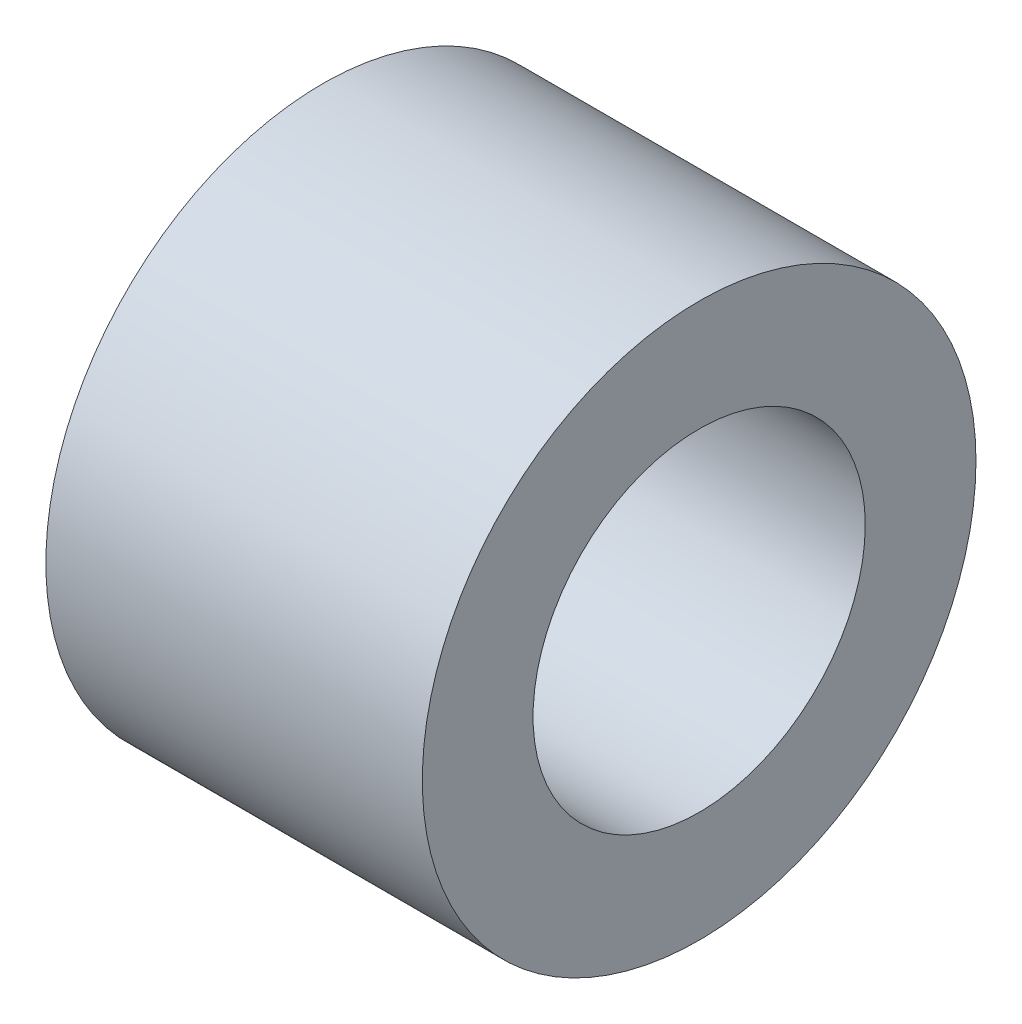
ISO-10303-21;
HEADER;
FILE_DESCRIPTION(('STEP AP214'),'2;1');
FILE_NAME('part.step','',(''),(''),'','','');
FILE_SCHEMA(('AUTOMOTIVE_DESIGN { 1 0 10303 214 1 1 1 1 }'));
ENDSEC;
DATA;
#1=APPLICATION_CONTEXT('core data for automotive mechanical design processes');
#2=APPLICATION_PROTOCOL_DEFINITION('international standard','automotive_design',2000,#1);
#3=PRODUCT_CONTEXT('',#1,'mechanical');
#4=PRODUCT('Part','Part','',(#3));
#5=PRODUCT_RELATED_PRODUCT_CATEGORY('part','',(#4));
#6=PRODUCT_DEFINITION_FORMATION('','',#4);
#7=PRODUCT_DEFINITION_CONTEXT('part definition',#1,'design');
#8=PRODUCT_DEFINITION('design','',#6,#7);
#9=PRODUCT_DEFINITION_SHAPE('','',#8);
#10=(LENGTH_UNIT() NAMED_UNIT(*) SI_UNIT(.MILLI.,.METRE.));
#11=(NAMED_UNIT(*) PLANE_ANGLE_UNIT() SI_UNIT($,.RADIAN.));
#12=(NAMED_UNIT(*) SI_UNIT($,.STERADIAN.) SOLID_ANGLE_UNIT());
#13=UNCERTAINTY_MEASURE_WITH_UNIT(LENGTH_MEASURE(1.E-05),#10,'distance_accuracy_value','');
#14=(GEOMETRIC_REPRESENTATION_CONTEXT(3) GLOBAL_UNCERTAINTY_ASSIGNED_CONTEXT((#13)) GLOBAL_UNIT_ASSIGNED_CONTEXT((#10,
#11,#12)) REPRESENTATION_CONTEXT('',''));
#15=CARTESIAN_POINT('',(0.,0.,0.));
#16=DIRECTION('',(0.,0.,1.));
#17=DIRECTION('',(1.,0.,0.));
#18=AXIS2_PLACEMENT_3D('',#15,#16,#17);
#19=CARTESIAN_POINT('',(3.4,0.,0.));
#20=DIRECTION('',(1.,0.,0.));
#21=DIRECTION('',(0.,0.,-1.));
#22=AXIS2_PLACEMENT_3D('',#19,#20,#21);
#23=PLANE('',#22);
#24=CARTESIAN_POINT('',(3.4,0.,0.));
#25=DIRECTION('',(1.,0.,0.));
#26=DIRECTION('',(0.,0.,-1.));
#27=AXIS2_PLACEMENT_3D('',#24,#25,#26);
#28=CIRCLE('',#27,2.5);
#29=CARTESIAN_POINT('',(3.4,0.,-2.5));
#30=VERTEX_POINT('',#29);
#31=EDGE_CURVE('E10',#30,#30,#28,.T.);
#32=ORIENTED_EDGE('',*,*,#31,.T.);
#33=EDGE_LOOP('',(#32));
#34=FACE_BOUND('',#33,.T.);
#35=CARTESIAN_POINT('',(3.4,0.,0.));
#36=DIRECTION('',(1.,0.,0.));
#37=DIRECTION('',(0.,0.,-1.));
#38=AXIS2_PLACEMENT_3D('',#35,#36,#37);
#39=CIRCLE('',#38,1.5);
#40=CARTESIAN_POINT('',(3.4,0.,-1.5));
#41=VERTEX_POINT('',#40);
#42=EDGE_CURVE('E54',#41,#41,#39,.T.);
#43=ORIENTED_EDGE('',*,*,#42,.F.);
#44=EDGE_LOOP('',(#43));
#45=FACE_BOUND('',#44,.T.);
#46=ADVANCED_FACE('F41',(#34,#45),#23,.T.);
#47=CARTESIAN_POINT('',(0.,0.,0.));
#48=DIRECTION('',(1.,0.,0.));
#49=DIRECTION('',(0.,0.,-1.));
#50=AXIS2_PLACEMENT_3D('',#47,#48,#49);
#51=PLANE('',#50);
#52=CARTESIAN_POINT('',(0.,0.,0.));
#53=DIRECTION('',(1.,0.,0.));
#54=DIRECTION('',(0.,0.,-1.));
#55=AXIS2_PLACEMENT_3D('',#52,#53,#54);
#56=CIRCLE('',#55,2.5);
#57=CARTESIAN_POINT('',(0.,0.,-2.5));
#58=VERTEX_POINT('',#57);
#59=EDGE_CURVE('E45',#58,#58,#56,.T.);
#60=ORIENTED_EDGE('',*,*,#59,.F.);
#61=EDGE_LOOP('',(#60));
#62=FACE_BOUND('',#61,.T.);
#63=CARTESIAN_POINT('',(0.,0.,0.));
#64=DIRECTION('',(1.,0.,0.));
#65=DIRECTION('',(0.,0.,-1.));
#66=AXIS2_PLACEMENT_3D('',#63,#64,#65);
#67=CIRCLE('',#66,1.5);
#68=CARTESIAN_POINT('',(0.,0.,-1.5));
#69=VERTEX_POINT('',#68);
#70=EDGE_CURVE('E56',#69,#69,#67,.T.);
#71=ORIENTED_EDGE('',*,*,#70,.T.);
#72=EDGE_LOOP('',(#71));
#73=FACE_BOUND('',#72,.T.);
#74=ADVANCED_FACE('F68',(#62,#73),#51,.F.);
#75=CARTESIAN_POINT('',(3.4,0.,0.));
#76=DIRECTION('',(-1.,0.,0.));
#77=DIRECTION('',(0.,0.,1.));
#78=AXIS2_PLACEMENT_3D('',#75,#76,#77);
#79=CYLINDRICAL_SURFACE('',#78,2.5);
#80=ORIENTED_EDGE('',*,*,#31,.F.);
#81=EDGE_LOOP('',(#80));
#82=FACE_BOUND('',#81,.T.);
#83=ORIENTED_EDGE('',*,*,#59,.T.);
#84=EDGE_LOOP('',(#83));
#85=FACE_BOUND('',#84,.T.);
#86=ADVANCED_FACE('F43',(#82,#85),#79,.T.);
#87=CARTESIAN_POINT('',(3.4,0.,0.));
#88=DIRECTION('',(-1.,0.,0.));
#89=DIRECTION('',(0.,0.,1.));
#90=AXIS2_PLACEMENT_3D('',#87,#88,#89);
#91=CYLINDRICAL_SURFACE('',#90,1.5);
#92=ORIENTED_EDGE('',*,*,#42,.T.);
#93=EDGE_LOOP('',(#92));
#94=FACE_BOUND('',#93,.T.);
#95=ORIENTED_EDGE('',*,*,#70,.F.);
#96=EDGE_LOOP('',(#95));
#97=FACE_BOUND('',#96,.T.);
#98=ADVANCED_FACE('F64',(#94,#97),#91,.F.);
#99=CLOSED_SHELL('',(#46,#74,#86,#98));
#100=MANIFOLD_SOLID_BREP('B2',#99);
#101=ADVANCED_BREP_SHAPE_REPRESENTATION('',(#18,#100),#14);
#102=SHAPE_DEFINITION_REPRESENTATION(#9,#101);
ENDSEC;
END-ISO-10303-21;
